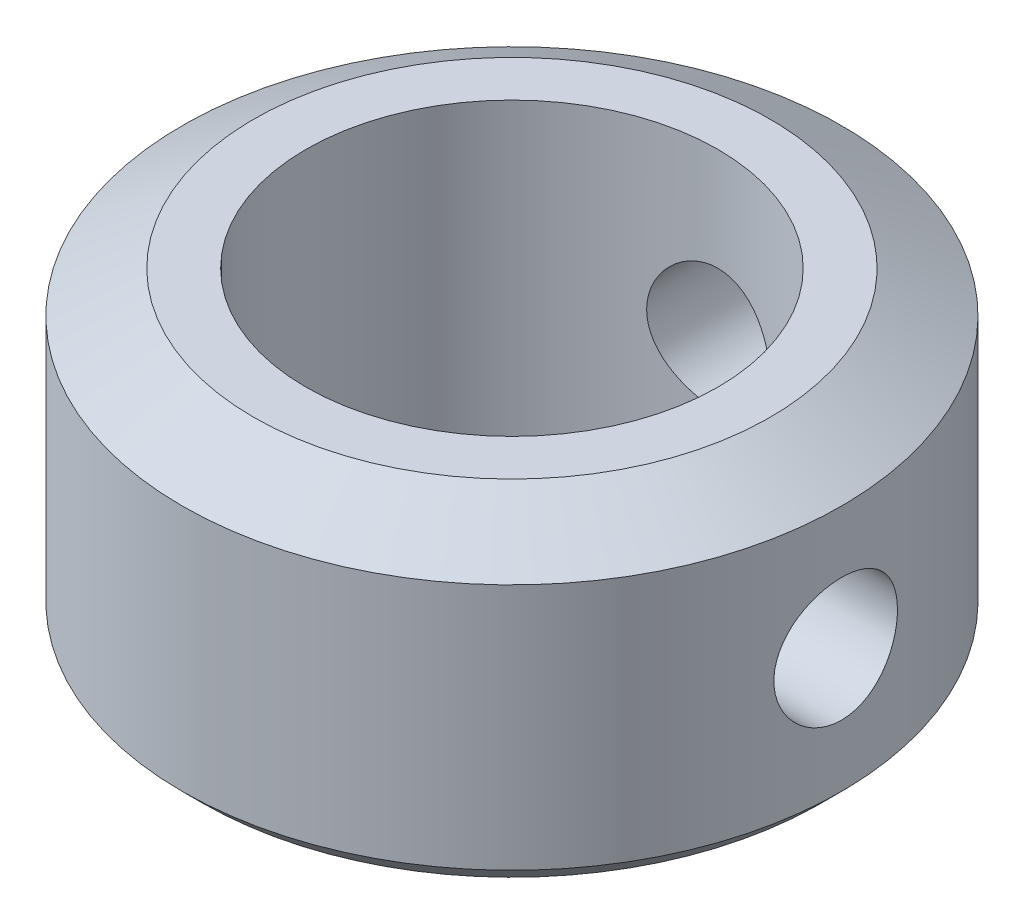
ISO-10303-21;
HEADER;
FILE_DESCRIPTION(('STEP AP214'),'2;1');
FILE_NAME('part.step','',(''),(''),'','','');
FILE_SCHEMA(('AUTOMOTIVE_DESIGN { 1 0 10303 214 1 1 1 1 }'));
ENDSEC;
DATA;
#1=APPLICATION_CONTEXT('core data for automotive mechanical design processes');
#2=APPLICATION_PROTOCOL_DEFINITION('international standard','automotive_design',2000,#1);
#3=PRODUCT_CONTEXT('',#1,'mechanical');
#4=PRODUCT('Part','Part','',(#3));
#5=PRODUCT_RELATED_PRODUCT_CATEGORY('part','',(#4));
#6=PRODUCT_DEFINITION_FORMATION('','',#4);
#7=PRODUCT_DEFINITION_CONTEXT('part definition',#1,'design');
#8=PRODUCT_DEFINITION('design','',#6,#7);
#9=PRODUCT_DEFINITION_SHAPE('','',#8);
#10=(LENGTH_UNIT() NAMED_UNIT(*) SI_UNIT(.MILLI.,.METRE.));
#11=(NAMED_UNIT(*) PLANE_ANGLE_UNIT() SI_UNIT($,.RADIAN.));
#12=(NAMED_UNIT(*) SI_UNIT($,.STERADIAN.) SOLID_ANGLE_UNIT());
#13=UNCERTAINTY_MEASURE_WITH_UNIT(LENGTH_MEASURE(1.E-05),#10,'distance_accuracy_value','');
#14=(GEOMETRIC_REPRESENTATION_CONTEXT(3) GLOBAL_UNCERTAINTY_ASSIGNED_CONTEXT((#13)) GLOBAL_UNIT_ASSIGNED_CONTEXT((#10,
#11,#12)) REPRESENTATION_CONTEXT('',''));
#15=CARTESIAN_POINT('',(0.,0.,0.));
#16=DIRECTION('',(0.,0.,1.));
#17=DIRECTION('',(1.,0.,0.));
#18=AXIS2_PLACEMENT_3D('',#15,#16,#17);
#19=CARTESIAN_POINT('',(0.,7.5,0.));
#20=DIRECTION('',(0.,1.,0.));
#21=DIRECTION('',(0.,0.,1.));
#22=AXIS2_PLACEMENT_3D('',#19,#20,#21);
#23=PLANE('',#22);
#24=CARTESIAN_POINT('',(0.,7.5,0.));
#25=DIRECTION('',(0.,1.,0.));
#26=DIRECTION('',(0.,0.,1.));
#27=AXIS2_PLACEMENT_3D('',#24,#25,#26);
#28=CIRCLE('',#27,6.26794919243112);
#29=CARTESIAN_POINT('',(0.,7.5,6.26794919243112));
#30=VERTEX_POINT('',#29);
#31=EDGE_CURVE('E55',#30,#30,#28,.T.);
#32=ORIENTED_EDGE('',*,*,#31,.T.);
#33=EDGE_LOOP('',(#32));
#34=FACE_BOUND('',#33,.T.);
#35=CARTESIAN_POINT('',(0.,7.5,0.));
#36=DIRECTION('',(0.,1.,0.));
#37=DIRECTION('',(0.,0.,1.));
#38=AXIS2_PLACEMENT_3D('',#35,#36,#37);
#39=CIRCLE('',#38,5.);
#40=CARTESIAN_POINT('',(0.,7.5,5.));
#41=VERTEX_POINT('',#40);
#42=EDGE_CURVE('E58',#41,#41,#39,.T.);
#43=ORIENTED_EDGE('',*,*,#42,.F.);
#44=EDGE_LOOP('',(#43));
#45=FACE_BOUND('',#44,.T.);
#46=ADVANCED_FACE('F32',(#34,#45),#23,.T.);
#47=CARTESIAN_POINT('',(0.,0.,0.));
#48=DIRECTION('',(0.,1.,0.));
#49=DIRECTION('',(0.,0.,1.));
#50=AXIS2_PLACEMENT_3D('',#47,#48,#49);
#51=PLANE('',#50);
#52=CARTESIAN_POINT('',(0.,0.,0.));
#53=DIRECTION('',(0.,1.,0.));
#54=DIRECTION('',(0.,0.,1.));
#55=AXIS2_PLACEMENT_3D('',#52,#53,#54);
#56=CIRCLE('',#55,5.2);
#57=CARTESIAN_POINT('',(0.,0.,5.2));
#58=VERTEX_POINT('',#57);
#59=EDGE_CURVE('E39',#58,#58,#56,.T.);
#60=ORIENTED_EDGE('',*,*,#59,.T.);
#61=EDGE_LOOP('',(#60));
#62=FACE_BOUND('',#61,.T.);
#63=CARTESIAN_POINT('',(0.,0.,0.));
#64=DIRECTION('',(0.,1.,0.));
#65=DIRECTION('',(0.,0.,1.));
#66=AXIS2_PLACEMENT_3D('',#63,#64,#65);
#67=CIRCLE('',#66,7.5);
#68=CARTESIAN_POINT('',(0.,0.,7.5));
#69=VERTEX_POINT('',#68);
#70=EDGE_CURVE('E43',#69,#69,#67,.F.);
#71=ORIENTED_EDGE('',*,*,#70,.T.);
#72=EDGE_LOOP('',(#71));
#73=FACE_BOUND('',#72,.T.);
#74=ADVANCED_FACE('F111',(#62,#73),#51,.F.);
#75=CARTESIAN_POINT('',(0.,7.5,0.));
#76=DIRECTION('',(0.,-1.,0.));
#77=DIRECTION('',(0.,0.,-1.));
#78=AXIS2_PLACEMENT_3D('',#75,#76,#77);
#79=CYLINDRICAL_SURFACE('',#78,8.);
#80=CARTESIAN_POINT('',(-1.50000000000003,3.5,-7.85811682275085));
#81=CARTESIAN_POINT('',(-1.49999679883248,3.58345720801174,-7.85811843793493));
#82=CARTESIAN_POINT('',(-1.49301126348939,3.66695594821839,-7.85946079760266));
#83=CARTESIAN_POINT('',(-1.46527253251808,3.83159896158191,-7.86467851014364));
#84=CARTESIAN_POINT('',(-1.4445076576848,3.91274117642748,-7.86855601173205));
#85=CARTESIAN_POINT('',(-1.3898703561779,4.07026507137087,-7.87838976464884));
#86=CARTESIAN_POINT('',(-1.35601013954377,4.14665110930729,-7.88434407905997));
#87=CARTESIAN_POINT('',(-1.27617565760369,4.29265355928681,-7.89765826320959));
#88=CARTESIAN_POINT('',(-1.23020233759196,4.3622704990033,-7.90501802325621));
#89=CARTESIAN_POINT('',(-1.12683678942625,4.49363019919913,-7.92041614838944));
#90=CARTESIAN_POINT('',(-1.06932292933094,4.55527648347173,-7.92846116625679));
#91=CARTESIAN_POINT('',(-0.944771778803578,4.66810438959956,-7.94426457664033));
#92=CARTESIAN_POINT('',(-0.877733863624972,4.71928532442479,-7.95202295031152));
#93=CARTESIAN_POINT('',(-0.735403894570189,4.81009937660052,-7.96645017828405));
#94=CARTESIAN_POINT('',(-0.660052840033892,4.84964153351942,-7.97311028052363));
#95=CARTESIAN_POINT('',(-0.503631283250789,4.91546954227353,-7.9845160863293));
#96=CARTESIAN_POINT('',(-0.422561251859532,4.94175648399022,-7.98926194728334));
#97=CARTESIAN_POINT('',(-0.258002746187443,4.98002954861113,-7.99625755123778));
#98=CARTESIAN_POINT('',(-0.174553323244884,4.99217830592268,-7.99853565976327));
#99=CARTESIAN_POINT('',(-0.00677167603540987,5.0023368877004,-8.00043684615594));
#100=CARTESIAN_POINT('',(0.0775604724476434,5.00034791613906,-8.00006015010697));
#101=CARTESIAN_POINT('',(0.24359835789937,4.98241222885285,-7.99671633763241));
#102=CARTESIAN_POINT('',(0.325323760451442,4.96664063056999,-7.99378172247214));
#103=CARTESIAN_POINT('',(0.484947165715449,4.92186435060476,-7.98568826333561));
#104=CARTESIAN_POINT('',(0.562845028826514,4.89285918665419,-7.98052933829966));
#105=CARTESIAN_POINT('',(0.713110065751494,4.8222722689417,-7.9685126029734));
#106=CARTESIAN_POINT('',(0.785443571838506,4.7806205120875,-7.96164537590826));
#107=CARTESIAN_POINT('',(0.922159977214611,4.68597433092284,-7.9469714754285));
#108=CARTESIAN_POINT('',(0.986542066910758,4.63297875311242,-7.93916470651164));
#109=CARTESIAN_POINT('',(1.10656561896901,4.51618429701647,-7.92333513680567));
#110=CARTESIAN_POINT('',(1.16205790757039,4.45223221609792,-7.91531085901622));
#111=CARTESIAN_POINT('',(1.26155171851258,4.31585046872137,-7.90006508924621));
#112=CARTESIAN_POINT('',(1.30555307271179,4.24342067823536,-7.89284360901351));
#113=CARTESIAN_POINT('',(1.38085852224475,4.09194172929734,-7.88001893307122));
#114=CARTESIAN_POINT('',(1.41214093645419,4.01288154280935,-7.87441850530262));
#115=CARTESIAN_POINT('',(1.46093656975053,3.8504988158768,-7.8655124239669));
#116=CARTESIAN_POINT('',(1.47845134901105,3.76717675953521,-7.8622065103862));
#117=CARTESIAN_POINT('',(1.49899672649736,3.59998067114412,-7.85831520301006));
#118=CARTESIAN_POINT('',(1.50224164285856,3.51613388443448,-7.85768955816137));
#119=CARTESIAN_POINT('',(1.49472968881722,3.34909654491285,-7.85912191420841));
#120=CARTESIAN_POINT('',(1.4839735108643,3.26590595985191,-7.86117978238612));
#121=CARTESIAN_POINT('',(1.4489486819588,3.10324709694561,-7.86770980063206));
#122=CARTESIAN_POINT('',(1.42479238583987,3.0237537473751,-7.87216186690879));
#123=CARTESIAN_POINT('',(1.36377224379057,2.86994281026984,-7.88296134156619));
#124=CARTESIAN_POINT('',(1.32690746128792,2.79562560468467,-7.88930888963282));
#125=CARTESIAN_POINT('',(1.24102353119657,2.65333238095683,-7.90327577863686));
#126=CARTESIAN_POINT('',(1.19186899639618,2.58543946213392,-7.91090895425316));
#127=CARTESIAN_POINT('',(1.08298344344244,2.45878795978567,-7.92654811368101));
#128=CARTESIAN_POINT('',(1.02325147433081,2.40003019844422,-7.93455413096494));
#129=CARTESIAN_POINT('',(0.893949417870357,2.29251623646587,-7.95016624005946));
#130=CARTESIAN_POINT('',(0.824258534095862,2.24390417339403,-7.95776555833305));
#131=CARTESIAN_POINT('',(0.677574523040111,2.15907879382233,-7.97159404810351));
#132=CARTESIAN_POINT('',(0.6005816770385,2.12286499997499,-7.97782327234725));
#133=CARTESIAN_POINT('',(0.441877541578655,2.06407990213592,-7.98818057995848));
#134=CARTESIAN_POINT('',(0.360193213078959,2.04143781243859,-7.99231954730142));
#135=CARTESIAN_POINT('',(0.194096227381542,2.01021295171011,-7.99807642083745));
#136=CARTESIAN_POINT('',(0.109683858215822,2.00162870133729,-7.99969459229933));
#137=CARTESIAN_POINT('',(-0.058090760250538,1.99881469848156,-8.00022227515441));
#138=CARTESIAN_POINT('',(-0.141449307066297,2.00436724687047,-7.99917286625032));
#139=CARTESIAN_POINT('',(-0.306023369279228,2.02919242776843,-7.99456866611703));
#140=CARTESIAN_POINT('',(-0.387238905213718,2.04846492874421,-7.99101389890671));
#141=CARTESIAN_POINT('',(-0.545106475595513,2.10009120738372,-7.98179837978045));
#142=CARTESIAN_POINT('',(-0.621766319318252,2.13242181288101,-7.97614135981576));
#143=CARTESIAN_POINT('',(-0.768605631316723,2.20922045365518,-7.96333372068771));
#144=CARTESIAN_POINT('',(-0.838784665003299,2.25368930210665,-7.95618300146483));
#145=CARTESIAN_POINT('',(-0.971755027780035,2.35425145444232,-7.94104779859941));
#146=CARTESIAN_POINT('',(-1.03442623539056,2.4105020338617,-7.93305284591271));
#147=CARTESIAN_POINT('',(-1.14951536065488,2.53270456249271,-7.91719633538833));
#148=CARTESIAN_POINT('',(-1.20193086324783,2.59865879037372,-7.90933480936764));
#149=CARTESIAN_POINT('',(-1.29547633945388,2.73912645470334,-7.89455577425925));
#150=CARTESIAN_POINT('',(-1.33649740531875,2.81371343966764,-7.88764767280728));
#151=CARTESIAN_POINT('',(-1.40536132423419,2.96882578997974,-7.87567084650032));
#152=CARTESIAN_POINT('',(-1.43321661638915,3.04934546658938,-7.87060038649116));
#153=CARTESIAN_POINT('',(-1.46929726596178,3.19175228806591,-7.86393016292124));
#154=CARTESIAN_POINT('',(-1.48079105739853,3.25280572376194,-7.86176310717932));
#155=CARTESIAN_POINT('',(-1.49614351076218,3.37589846842032,-7.85885585595504));
#156=CARTESIAN_POINT('',(-1.5000023805213,3.43793775050033,-7.85811562163282));
#157=CARTESIAN_POINT('',(-1.50000000000003,3.5,-7.85811682275085));
#158=B_SPLINE_CURVE_WITH_KNOTS('',3,(#80,#81,#82,#83,#84,#85,#86,#87,#88,#89,#90,#91,#92,#93,
#94,#95,#96,#97,#98,#99,#100,#101,#102,#103,#104,#105,#106,#107,#108,#109,#110,#111,#112,#113,
#114,#115,#116,#117,#118,#119,#120,#121,#122,#123,#124,#125,#126,#127,#128,#129,#130,#131,#132,
#133,#134,#135,#136,#137,#138,#139,#140,#141,#142,#143,#144,#145,#146,#147,#148,#149,#150,#151,
#152,#153,#154,#155,#156,#157),.UNSPECIFIED.,.T.,.F.,(4,2,2,2,2,2,2,2,2,2,2,2,2,2,2,2,2,2,2,2,2,
2,2,2,2,2,2,2,2,2,2,2,2,2,2,2,2,2,4),(0.,0.250144505793186,0.500501302380393,0.750625227978433,
1.00072963993908,1.25362335698691,1.50653367069315,1.76137104348047,2.0161874593964,
2.26804275460261,2.51987660200648,2.76855650598725,3.01724547328425,3.26733691984219,
3.51745380911785,3.77140614764064,4.025362201924,4.27974936118266,4.53410768866488,
4.78463248587075,5.03514489338718,5.28358792315369,5.53204926624317,5.78337862654143,
6.03473059394677,6.28944125495871,6.54414210821705,6.79750269418683,7.0508366166733,
7.30029300570138,7.54974700322167,7.79876026530358,8.0477902135711,8.30038464008745,
8.55303847730765,8.80803001818118,9.06278015749119,9.24880307527215,9.43482092920425),.UNSPECIFIED.);
#159=CARTESIAN_POINT('',(-1.50000000000003,3.5,-7.85811682275085));
#160=VERTEX_POINT('',#159);
#161=EDGE_CURVE('E90',#160,#160,#158,.T.);
#162=ORIENTED_EDGE('',*,*,#161,.F.);
#163=EDGE_LOOP('',(#162));
#164=FACE_BOUND('',#163,.T.);
#165=CARTESIAN_POINT('',(7.85811682275086,3.5,-1.5));
#166=CARTESIAN_POINT('',(7.85811843793494,3.58345720801174,-1.49999679883246));
#167=CARTESIAN_POINT('',(7.85946079760266,3.66695594821839,-1.49301126348936));
#168=CARTESIAN_POINT('',(7.86467851014364,3.83159896158191,-1.46527253251805));
#169=CARTESIAN_POINT('',(7.86855601173205,3.91274117642748,-1.44450765768477));
#170=CARTESIAN_POINT('',(7.87838976464885,4.07026507137087,-1.38987035617788));
#171=CARTESIAN_POINT('',(7.88434407905997,4.14665110930729,-1.35601013954374));
#172=CARTESIAN_POINT('',(7.89765826320959,4.29265355928681,-1.27617565760366));
#173=CARTESIAN_POINT('',(7.90501802325622,4.3622704990033,-1.23020233759193));
#174=CARTESIAN_POINT('',(7.92041614838944,4.49363019919913,-1.12683678942622));
#175=CARTESIAN_POINT('',(7.92846116625679,4.55527648347173,-1.06932292933092));
#176=CARTESIAN_POINT('',(7.94426457664034,4.66810438959956,-0.944771778803551));
#177=CARTESIAN_POINT('',(7.95202295031153,4.71928532442479,-0.877733863624944));
#178=CARTESIAN_POINT('',(7.96645017828405,4.81009937660052,-0.735403894570161));
#179=CARTESIAN_POINT('',(7.97311028052363,4.84964153351942,-0.660052840033864));
#180=CARTESIAN_POINT('',(7.98451608632931,4.91546954227353,-0.503631283250761));
#181=CARTESIAN_POINT('',(7.98926194728334,4.94175648399022,-0.422561251859505));
#182=CARTESIAN_POINT('',(7.99625755123778,4.98002954861113,-0.258002746187415));
#183=CARTESIAN_POINT('',(7.99853565976327,4.99217830592268,-0.174553323244856));
#184=CARTESIAN_POINT('',(8.00043684615594,5.0023368877004,-0.00677167603538234));
#185=CARTESIAN_POINT('',(8.00006015010697,5.00034791613906,0.077560472447671));
#186=CARTESIAN_POINT('',(7.99671633763241,4.98241222885285,0.243598357899397));
#187=CARTESIAN_POINT('',(7.99378172247214,4.96664063056999,0.32532376045147));
#188=CARTESIAN_POINT('',(7.98568826333561,4.92186435060476,0.484947165715476));
#189=CARTESIAN_POINT('',(7.98052933829966,4.89285918665419,0.562845028826541));
#190=CARTESIAN_POINT('',(7.96851260297339,4.8222722689417,0.713110065751522));
#191=CARTESIAN_POINT('',(7.96164537590825,4.7806205120875,0.785443571838533));
#192=CARTESIAN_POINT('',(7.9469714754285,4.68597433092285,0.922159977214638));
#193=CARTESIAN_POINT('',(7.93916470651164,4.63297875311242,0.986542066910785));
#194=CARTESIAN_POINT('',(7.92333513680567,4.51618429701647,1.10656561896904));
#195=CARTESIAN_POINT('',(7.91531085901621,4.45223221609792,1.16205790757041));
#196=CARTESIAN_POINT('',(7.9000650892462,4.31585046872137,1.26155171851261));
#197=CARTESIAN_POINT('',(7.89284360901351,4.24342067823536,1.30555307271182));
#198=CARTESIAN_POINT('',(7.88001893307121,4.09194172929734,1.38085852224478));
#199=CARTESIAN_POINT('',(7.87441850530261,4.01288154280935,1.41214093645421));
#200=CARTESIAN_POINT('',(7.86551242396689,3.8504988158768,1.46093656975056));
#201=CARTESIAN_POINT('',(7.8622065103862,3.76717675953521,1.47845134901108));
#202=CARTESIAN_POINT('',(7.85831520301005,3.59998067114412,1.49899672649739));
#203=CARTESIAN_POINT('',(7.85768955816136,3.51613388443448,1.50224164285859));
#204=CARTESIAN_POINT('',(7.8591219142084,3.34909654491285,1.49472968881724));
#205=CARTESIAN_POINT('',(7.86117978238611,3.26590595985191,1.48397351086433));
#206=CARTESIAN_POINT('',(7.86770980063205,3.10324709694561,1.44894868195883));
#207=CARTESIAN_POINT('',(7.87216186690878,3.0237537473751,1.4247923858399));
#208=CARTESIAN_POINT('',(7.88296134156619,2.86994281026984,1.3637722437906));
#209=CARTESIAN_POINT('',(7.88930888963281,2.79562560468467,1.32690746128795));
#210=CARTESIAN_POINT('',(7.90327577863685,2.65333238095683,1.2410235311966));
#211=CARTESIAN_POINT('',(7.91090895425315,2.58543946213393,1.19186899639621));
#212=CARTESIAN_POINT('',(7.926548113681,2.45878795978567,1.08298344344247));
#213=CARTESIAN_POINT('',(7.93455413096494,2.40003019844423,1.02325147433084));
#214=CARTESIAN_POINT('',(7.95016624005946,2.29251623646587,0.893949417870385));
#215=CARTESIAN_POINT('',(7.95776555833305,2.24390417339403,0.82425853409589));
#216=CARTESIAN_POINT('',(7.97159404810351,2.15907879382233,0.67757452304014));
#217=CARTESIAN_POINT('',(7.97782327234725,2.12286499997499,0.600581677038528));
#218=CARTESIAN_POINT('',(7.98818057995848,2.06407990213592,0.441877541578684));
#219=CARTESIAN_POINT('',(7.99231954730142,2.04143781243859,0.360193213078987));
#220=CARTESIAN_POINT('',(7.99807642083745,2.01021295171011,0.19409622738157));
#221=CARTESIAN_POINT('',(7.99969459229933,2.00162870133729,0.10968385821585));
#222=CARTESIAN_POINT('',(8.00022227515441,1.99881469848156,-0.0580907602505099));
#223=CARTESIAN_POINT('',(7.99917286625032,2.00436724687047,-0.141449307066269));
#224=CARTESIAN_POINT('',(7.99456866611703,2.02919242776843,-0.3060233692792));
#225=CARTESIAN_POINT('',(7.99101389890671,2.04846492874421,-0.38723890521369));
#226=CARTESIAN_POINT('',(7.98179837978045,2.10009120738372,-0.545106475595485));
#227=CARTESIAN_POINT('',(7.97614135981576,2.13242181288101,-0.621766319318224));
#228=CARTESIAN_POINT('',(7.96333372068771,2.20922045365518,-0.768605631316695));
#229=CARTESIAN_POINT('',(7.95618300146483,2.25368930210665,-0.838784665003271));
#230=CARTESIAN_POINT('',(7.94104779859941,2.35425145444232,-0.971755027780007));
#231=CARTESIAN_POINT('',(7.93305284591272,2.4105020338617,-1.03442623539053));
#232=CARTESIAN_POINT('',(7.91719633538833,2.53270456249271,-1.14951536065485));
#233=CARTESIAN_POINT('',(7.90933480936765,2.59865879037372,-1.2019308632478));
#234=CARTESIAN_POINT('',(7.89455577425926,2.73912645470334,-1.29547633945385));
#235=CARTESIAN_POINT('',(7.88764767280729,2.81371343966764,-1.33649740531872));
#236=CARTESIAN_POINT('',(7.87567084650033,2.96882578997974,-1.40536132423417));
#237=CARTESIAN_POINT('',(7.87060038649116,3.04934546658938,-1.43321661638912));
#238=CARTESIAN_POINT('',(7.86393016292125,3.19175228806591,-1.46929726596175));
#239=CARTESIAN_POINT('',(7.86176310717932,3.25280572376194,-1.4807910573985));
#240=CARTESIAN_POINT('',(7.85885585595504,3.37589846842032,-1.49614351076215));
#241=CARTESIAN_POINT('',(7.85811562163282,3.43793775050033,-1.50000238052127));
#242=CARTESIAN_POINT('',(7.85811682275086,3.5,-1.5));
#243=B_SPLINE_CURVE_WITH_KNOTS('',3,(#165,#166,#167,#168,#169,#170,#171,#172,#173,#174,#175,
#176,#177,#178,#179,#180,#181,#182,#183,#184,#185,#186,#187,#188,#189,#190,#191,#192,#193,#194,
#195,#196,#197,#198,#199,#200,#201,#202,#203,#204,#205,#206,#207,#208,#209,#210,#211,#212,#213,
#214,#215,#216,#217,#218,#219,#220,#221,#222,#223,#224,#225,#226,#227,#228,#229,#230,#231,#232,
#233,#234,#235,#236,#237,#238,#239,#240,#241,#242),.UNSPECIFIED.,.T.,.F.,(4,2,2,2,2,2,2,2,2,2,2,
2,2,2,2,2,2,2,2,2,2,2,2,2,2,2,2,2,2,2,2,2,2,2,2,2,2,2,4),(0.,0.250144505793187,
0.500501302380393,0.750625227978433,1.00072963993908,1.25362335698691,1.50653367069315,
1.76137104348047,2.0161874593964,2.26804275460261,2.51987660200648,2.76855650598725,
3.01724547328425,3.26733691984219,3.51745380911785,3.77140614764064,4.025362201924,
4.27974936118267,4.53410768866488,4.78463248587075,5.03514489338718,5.28358792315369,
5.53204926624317,5.78337862654143,6.03473059394677,6.28944125495871,6.54414210821705,
6.79750269418683,7.0508366166733,7.30029300570138,7.54974700322167,7.79876026530358,
8.0477902135711,8.30038464008745,8.55303847730765,8.80803001818118,9.06278015749119,
9.24880307527215,9.43482092920425),.UNSPECIFIED.);
#244=CARTESIAN_POINT('',(7.85811682275086,3.5,-1.5));
#245=VERTEX_POINT('',#244);
#246=EDGE_CURVE('E69',#245,#245,#243,.T.);
#247=ORIENTED_EDGE('',*,*,#246,.F.);
#248=EDGE_LOOP('',(#247));
#249=FACE_BOUND('',#248,.T.);
#250=CARTESIAN_POINT('',(0.,0.500000000000002,0.));
#251=DIRECTION('',(0.,1.,0.));
#252=DIRECTION('',(0.,0.,1.));
#253=AXIS2_PLACEMENT_3D('',#250,#251,#252);
#254=CIRCLE('',#253,8.);
#255=CARTESIAN_POINT('',(0.,0.500000000000002,8.));
#256=VERTEX_POINT('',#255);
#257=EDGE_CURVE('E47',#256,#256,#254,.T.);
#258=ORIENTED_EDGE('',*,*,#257,.T.);
#259=EDGE_LOOP('',(#258));
#260=FACE_BOUND('',#259,.T.);
#261=CARTESIAN_POINT('',(0.,6.5,0.));
#262=DIRECTION('',(0.,1.,0.));
#263=DIRECTION('',(0.,0.,1.));
#264=AXIS2_PLACEMENT_3D('',#261,#262,#263);
#265=CIRCLE('',#264,8.);
#266=CARTESIAN_POINT('',(0.,6.5,8.));
#267=VERTEX_POINT('',#266);
#268=EDGE_CURVE('E52',#267,#267,#265,.F.);
#269=ORIENTED_EDGE('',*,*,#268,.T.);
#270=EDGE_LOOP('',(#269));
#271=FACE_BOUND('',#270,.T.);
#272=ADVANCED_FACE('F107',(#164,#249,#260,#271),#79,.T.);
#273=CARTESIAN_POINT('',(0.,7.5,0.));
#274=DIRECTION('',(0.,-1.,0.));
#275=DIRECTION('',(0.,0.,-1.));
#276=AXIS2_PLACEMENT_3D('',#273,#274,#275);
#277=CYLINDRICAL_SURFACE('',#276,5.);
#278=CARTESIAN_POINT('',(-1.50000000000002,3.5,-4.76969600708472));
#279=CARTESIAN_POINT('',(-1.49999897633766,3.5821945479424,-4.76969685726979));
#280=CARTESIAN_POINT('',(-1.49322108167144,3.66439922414402,-4.77184390209068));
#281=CARTESIAN_POINT('',(-1.46635844446751,3.82640524959194,-4.78016578302899));
#282=CARTESIAN_POINT('',(-1.4462692557358,3.90620578650146,-4.78634196493467));
#283=CARTESIAN_POINT('',(-1.39352753269957,4.06103472827173,-4.80196102485632));
#284=CARTESIAN_POINT('',(-1.36089589394245,4.13607082963309,-4.81139846703232));
#285=CARTESIAN_POINT('',(-1.28406421917931,4.2796219339953,-4.83246932547566));
#286=CARTESIAN_POINT('',(-1.23986245137054,4.34813595868444,-4.84410307041019));
#287=CARTESIAN_POINT('',(-1.13964754141629,4.47886639057737,-4.86866862185765));
#288=CARTESIAN_POINT('',(-1.08333207175808,4.54084589794629,-4.88162808311635));
#289=CARTESIAN_POINT('',(-0.961136237579615,4.65463795132251,-4.90714861936757));
#290=CARTESIAN_POINT('',(-0.895254645461128,4.70644919044988,-4.91970964297705));
#291=CARTESIAN_POINT('',(-0.754111437793707,4.79946269983331,-4.94333214579389));
#292=CARTESIAN_POINT('',(-0.678684021335831,4.84042342444281,-4.95435724342404));
#293=CARTESIAN_POINT('',(-0.52162464536937,4.90898725904276,-4.97334435920684));
#294=CARTESIAN_POINT('',(-0.439994028387928,4.93659324985745,-4.98130703789495));
#295=CARTESIAN_POINT('',(-0.275323852630846,4.97688000109051,-4.99307646003589));
#296=CARTESIAN_POINT('',(-0.192391398953817,4.9899651276527,-4.99699557369338));
#297=CARTESIAN_POINT('',(-0.025421823749331,5.00211732464644,-5.00063201501348));
#298=CARTESIAN_POINT('',(0.0586150620503522,5.00118733940196,-5.00035022521079));
#299=CARTESIAN_POINT('',(0.222571156600144,4.98560713145697,-4.99569603817659));
#300=CARTESIAN_POINT('',(0.302536267641325,4.97139480619013,-4.9914542020526));
#301=CARTESIAN_POINT('',(0.45888921344251,4.93036866400571,-4.97951522112593));
#302=CARTESIAN_POINT('',(0.53527682132283,4.90355404905733,-4.97181785750586));
#303=CARTESIAN_POINT('',(0.683347326351264,4.83778797658144,-4.95365220986963));
#304=CARTESIAN_POINT('',(0.754965064694462,4.79869879719273,-4.94315269676706));
#305=CARTESIAN_POINT('',(0.89076467378314,4.70960214757177,-4.92049640648069));
#306=CARTESIAN_POINT('',(0.954944774872115,4.65959208703651,-4.90833923637778));
#307=CARTESIAN_POINT('',(1.07666048152978,4.5478022492484,-4.88311550488166));
#308=CARTESIAN_POINT('',(1.1338445804011,4.48564308097026,-4.87003195321461));
#309=CARTESIAN_POINT('',(1.23707651539822,4.35248998210995,-4.84483979887497));
#310=CARTESIAN_POINT('',(1.28312324482851,4.28149517461077,-4.8327312931702));
#311=CARTESIAN_POINT('',(1.36313995335449,4.13176053075101,-4.81077903197678));
#312=CARTESIAN_POINT('',(1.39698989237678,4.05295295413708,-4.80095810695957));
#313=CARTESIAN_POINT('',(1.45083362878412,3.89039279155445,-4.78496392548437));
#314=CARTESIAN_POINT('',(1.47083194640558,3.80664182846544,-4.7787894791583));
#315=CARTESIAN_POINT('',(1.49574770282163,3.63991763926072,-4.77104849541242));
#316=CARTESIAN_POINT('',(1.5011994638021,3.55703177610602,-4.76931878670441));
#317=CARTESIAN_POINT('',(1.49835947233061,3.39152709999013,-4.77021192441924));
#318=CARTESIAN_POINT('',(1.49006964371328,3.30890825126915,-4.7728341615659));
#319=CARTESIAN_POINT('',(1.46045763574188,3.14851162202913,-4.78197558554913));
#320=CARTESIAN_POINT('',(1.43947961431279,3.07066383573647,-4.78839176507489));
#321=CARTESIAN_POINT('',(1.38548577747938,2.91959830918508,-4.80429141231228));
#322=CARTESIAN_POINT('',(1.35246810342758,2.84638128585943,-4.81377535359074));
#323=CARTESIAN_POINT('',(1.27431871196499,2.70448253592787,-4.83505835023048));
#324=CARTESIAN_POINT('',(1.22888564172727,2.63597527901421,-4.84691271069799));
#325=CARTESIAN_POINT('',(1.12755301600383,2.50736189381919,-4.87148205646988));
#326=CARTESIAN_POINT('',(1.07165095534895,2.44725778238721,-4.88419724730004));
#327=CARTESIAN_POINT('',(0.948455132493581,2.33481959418526,-4.90963633548158));
#328=CARTESIAN_POINT('',(0.880811065857416,2.28286437101302,-4.92234245063004));
#329=CARTESIAN_POINT('',(0.737461784590231,2.19103329897225,-4.94584851748651));
#330=CARTESIAN_POINT('',(0.661756970543925,2.15115685021854,-4.95664856384717));
#331=CARTESIAN_POINT('',(0.504935504705203,2.0849999694317,-4.97505970474957));
#332=CARTESIAN_POINT('',(0.42386462203782,2.05861798384102,-4.98269453424966));
#333=CARTESIAN_POINT('',(0.258169966504569,2.01993908110958,-4.99401979596827));
#334=CARTESIAN_POINT('',(0.173547217354744,2.00763813405158,-4.9977113567088));
#335=CARTESIAN_POINT('',(0.00665215388272419,1.9977769559455,-5.00066544081399));
#336=CARTESIAN_POINT('',(-0.0755851790862252,1.99966730459217,-5.00009305111322));
#337=CARTESIAN_POINT('',(-0.238519481164422,2.01682163249912,-4.99497264465037));
#338=CARTESIAN_POINT('',(-0.319216537346547,2.03208485348044,-4.99042485330462));
#339=CARTESIAN_POINT('',(-0.475935813041377,2.07521166139962,-4.97791168358326));
#340=CARTESIAN_POINT('',(-0.55199892735141,2.10293818064901,-4.96998352900866));
#341=CARTESIAN_POINT('',(-0.698433237752071,2.17008191450719,-4.9515294303945));
#342=CARTESIAN_POINT('',(-0.768803496050598,2.20950105028619,-4.94100305949946));
#343=CARTESIAN_POINT('',(-0.904301892420582,2.30037345743004,-4.91803965828228));
#344=CARTESIAN_POINT('',(-0.969190250076786,2.35217143000077,-4.90555226923559));
#345=CARTESIAN_POINT('',(-1.08953757134596,2.4657103883328,-4.88023537212333));
#346=CARTESIAN_POINT('',(-1.14499380960195,2.52745423789815,-4.86740576641079));
#347=CARTESIAN_POINT('',(-1.2465626939455,2.66134077831051,-4.84240680631318));
#348=CARTESIAN_POINT('',(-1.29234759757958,2.73373855339044,-4.83026852693485));
#349=CARTESIAN_POINT('',(-1.37104313528777,2.88555517416102,-4.80852547508792));
#350=CARTESIAN_POINT('',(-1.4039599555729,2.9649706236012,-4.79891948596955));
#351=CARTESIAN_POINT('',(-1.45301942532951,3.11974043160627,-4.78427816717594));
#352=CARTESIAN_POINT('',(-1.47058859011233,3.19460864693099,-4.7788615484052));
#353=CARTESIAN_POINT('',(-1.49407818835146,3.34631522249577,-4.77157042597166));
#354=CARTESIAN_POINT('',(-1.50000095706097,3.42315318464525,-4.7696952122143));
#355=CARTESIAN_POINT('',(-1.50000000000002,3.5,-4.76969600708472));
#356=B_SPLINE_CURVE_WITH_KNOTS('',3,(#278,#279,#280,#281,#282,#283,#284,#285,#286,#287,#288,
#289,#290,#291,#292,#293,#294,#295,#296,#297,#298,#299,#300,#301,#302,#303,#304,#305,#306,#307,
#308,#309,#310,#311,#312,#313,#314,#315,#316,#317,#318,#319,#320,#321,#322,#323,#324,#325,#326,
#327,#328,#329,#330,#331,#332,#333,#334,#335,#336,#337,#338,#339,#340,#341,#342,#343,#344,#345,
#346,#347,#348,#349,#350,#351,#352,#353,#354,#355),.UNSPECIFIED.,.T.,.F.,(4,2,2,2,2,2,2,2,2,2,2,
2,2,2,2,2,2,2,2,2,2,2,2,2,2,2,2,2,2,2,2,2,2,2,2,2,2,2,4),(0.,0.246300165915543,
0.492682641689001,0.738656414466194,0.984667025370102,1.23773150007984,1.49082847871273,
1.74915939273645,2.00743455587877,2.25832140149558,2.50915554101441,2.7520012599088,
2.99486235890376,3.24055209335676,3.48630016590831,3.74152147023278,3.99676812491863,
4.25446238246266,4.51207250628411,4.76008080790309,5.00805439107388,5.24958594938817,
5.49115481045787,5.73920731809388,5.98731925928923,6.24479506100602,6.50225807324202,
6.75775391814325,7.01317662321682,7.2587630391122,7.50433553047754,7.74727096872219,
7.99024634491378,8.24099627054488,8.4918185262989,8.75011639669147,9.00828993963944,
9.23861153857447,9.4688869503356),.UNSPECIFIED.);
#357=CARTESIAN_POINT('',(-1.50000000000002,3.5,-4.76969600708472));
#358=VERTEX_POINT('',#357);
#359=EDGE_CURVE('E94',#358,#358,#356,.T.);
#360=ORIENTED_EDGE('',*,*,#359,.T.);
#361=EDGE_LOOP('',(#360));
#362=FACE_BOUND('',#361,.T.);
#363=CARTESIAN_POINT('',(4.76969600708473,3.5,-1.5));
#364=CARTESIAN_POINT('',(4.7696968572698,3.5821945479424,-1.49999897633764));
#365=CARTESIAN_POINT('',(4.77184390209069,3.66439922414402,-1.49322108167142));
#366=CARTESIAN_POINT('',(4.780165783029,3.82640524959194,-1.46635844446749));
#367=CARTESIAN_POINT('',(4.78634196493468,3.90620578650146,-1.44626925573578));
#368=CARTESIAN_POINT('',(4.80196102485633,4.06103472827173,-1.39352753269955));
#369=CARTESIAN_POINT('',(4.81139846703232,4.13607082963309,-1.36089589394243));
#370=CARTESIAN_POINT('',(4.83246932547567,4.2796219339953,-1.28406421917929));
#371=CARTESIAN_POINT('',(4.84410307041019,4.34813595868444,-1.23986245137053));
#372=CARTESIAN_POINT('',(4.86866862185765,4.47886639057737,-1.13964754141627));
#373=CARTESIAN_POINT('',(4.88162808311636,4.54084589794629,-1.08333207175807));
#374=CARTESIAN_POINT('',(4.90714861936757,4.65463795132251,-0.961136237579599));
#375=CARTESIAN_POINT('',(4.91970964297705,4.70644919044988,-0.895254645461111));
#376=CARTESIAN_POINT('',(4.94333214579389,4.79946269983331,-0.75411143779369));
#377=CARTESIAN_POINT('',(4.95435724342404,4.84042342444281,-0.678684021335814));
#378=CARTESIAN_POINT('',(4.97334435920684,4.90898725904276,-0.521624645369353));
#379=CARTESIAN_POINT('',(4.98130703789495,4.93659324985745,-0.439994028387911));
#380=CARTESIAN_POINT('',(4.99307646003589,4.97688000109051,-0.275323852630829));
#381=CARTESIAN_POINT('',(4.99699557369338,4.9899651276527,-0.1923913989538));
#382=CARTESIAN_POINT('',(5.00063201501348,5.00211732464644,-0.0254218237493144));
#383=CARTESIAN_POINT('',(5.00035022521079,5.00118733940196,0.0586150620503689));
#384=CARTESIAN_POINT('',(4.99569603817659,4.98560713145697,0.222571156600161));
#385=CARTESIAN_POINT('',(4.9914542020526,4.97139480619013,0.302536267641342));
#386=CARTESIAN_POINT('',(4.97951522112593,4.93036866400571,0.458889213442527));
#387=CARTESIAN_POINT('',(4.97181785750586,4.90355404905733,0.535276821322846));
#388=CARTESIAN_POINT('',(4.95365220986963,4.83778797658144,0.683347326351281));
#389=CARTESIAN_POINT('',(4.94315269676706,4.79869879719273,0.754965064694478));
#390=CARTESIAN_POINT('',(4.92049640648069,4.70960214757177,0.890764673783156));
#391=CARTESIAN_POINT('',(4.90833923637778,4.65959208703651,0.954944774872131));
#392=CARTESIAN_POINT('',(4.88311550488165,4.5478022492484,1.0766604815298));
#393=CARTESIAN_POINT('',(4.87003195321461,4.48564308097026,1.13384458040111));
#394=CARTESIAN_POINT('',(4.84483979887497,4.35248998210995,1.23707651539824));
#395=CARTESIAN_POINT('',(4.8327312931702,4.28149517461077,1.28312324482853));
#396=CARTESIAN_POINT('',(4.81077903197678,4.13176053075101,1.3631399533545));
#397=CARTESIAN_POINT('',(4.80095810695957,4.05295295413708,1.39698989237679));
#398=CARTESIAN_POINT('',(4.78496392548436,3.89039279155445,1.45083362878413));
#399=CARTESIAN_POINT('',(4.7787894791583,3.80664182846544,1.4708319464056));
#400=CARTESIAN_POINT('',(4.77104849541241,3.63991763926072,1.49574770282165));
#401=CARTESIAN_POINT('',(4.7693187867044,3.55703177610602,1.50119946380212));
#402=CARTESIAN_POINT('',(4.77021192441924,3.39152709999013,1.49835947233062));
#403=CARTESIAN_POINT('',(4.77283416156589,3.30890825126915,1.4900696437133));
#404=CARTESIAN_POINT('',(4.78197558554912,3.14851162202913,1.4604576357419));
#405=CARTESIAN_POINT('',(4.78839176507489,3.07066383573648,1.4394796143128));
#406=CARTESIAN_POINT('',(4.80429141231227,2.91959830918508,1.3854857774794));
#407=CARTESIAN_POINT('',(4.81377535359073,2.84638128585943,1.3524681034276));
#408=CARTESIAN_POINT('',(4.83505835023047,2.70448253592787,1.274318711965));
#409=CARTESIAN_POINT('',(4.84691271069799,2.63597527901421,1.22888564172729));
#410=CARTESIAN_POINT('',(4.87148205646987,2.5073618938192,1.12755301600385));
#411=CARTESIAN_POINT('',(4.88419724730003,2.44725778238721,1.07165095534897));
#412=CARTESIAN_POINT('',(4.90963633548158,2.33481959418526,0.948455132493598));
#413=CARTESIAN_POINT('',(4.92234245063004,2.28286437101302,0.880811065857434));
#414=CARTESIAN_POINT('',(4.94584851748651,2.19103329897225,0.737461784590248));
#415=CARTESIAN_POINT('',(4.95664856384717,2.15115685021854,0.661756970543943));
#416=CARTESIAN_POINT('',(4.97505970474957,2.0849999694317,0.504935504705221));
#417=CARTESIAN_POINT('',(4.98269453424966,2.05861798384102,0.423864622037839));
#418=CARTESIAN_POINT('',(4.99401979596827,2.01993908110958,0.258169966504588));
#419=CARTESIAN_POINT('',(4.9977113567088,2.00763813405158,0.173547217354762));
#420=CARTESIAN_POINT('',(5.00066544081399,1.9977769559455,0.00665215388274223));
#421=CARTESIAN_POINT('',(5.00009305111322,1.99966730459217,-0.0755851790862073));
#422=CARTESIAN_POINT('',(4.99497264465037,2.01682163249912,-0.238519481164404));
#423=CARTESIAN_POINT('',(4.99042485330463,2.03208485348044,-0.319216537346529));
#424=CARTESIAN_POINT('',(4.97791168358327,2.07521166139962,-0.475935813041359));
#425=CARTESIAN_POINT('',(4.96998352900866,2.10293818064901,-0.551998927351392));
#426=CARTESIAN_POINT('',(4.9515294303945,2.17008191450719,-0.698433237752053));
#427=CARTESIAN_POINT('',(4.94100305949946,2.20950105028619,-0.76880349605058));
#428=CARTESIAN_POINT('',(4.91803965828228,2.30037345743003,-0.904301892420563));
#429=CARTESIAN_POINT('',(4.90555226923559,2.35217143000077,-0.969190250076767));
#430=CARTESIAN_POINT('',(4.88023537212334,2.4657103883328,-1.08953757134594));
#431=CARTESIAN_POINT('',(4.86740576641079,2.52745423789815,-1.14499380960194));
#432=CARTESIAN_POINT('',(4.84240680631319,2.66134077831051,-1.24656269394549));
#433=CARTESIAN_POINT('',(4.83026852693485,2.73373855339044,-1.29234759757956));
#434=CARTESIAN_POINT('',(4.80852547508793,2.88555517416102,-1.37104313528776));
#435=CARTESIAN_POINT('',(4.79891948596955,2.96497062360119,-1.40395995557289));
#436=CARTESIAN_POINT('',(4.78427816717595,3.11974043160627,-1.4530194253295));
#437=CARTESIAN_POINT('',(4.7788615484052,3.19460864693099,-1.47058859011232));
#438=CARTESIAN_POINT('',(4.77157042597167,3.34631522249577,-1.49407818835144));
#439=CARTESIAN_POINT('',(4.7696952122143,3.42315318464525,-1.50000095706095));
#440=CARTESIAN_POINT('',(4.76969600708473,3.5,-1.5));
#441=B_SPLINE_CURVE_WITH_KNOTS('',3,(#363,#364,#365,#366,#367,#368,#369,#370,#371,#372,#373,
#374,#375,#376,#377,#378,#379,#380,#381,#382,#383,#384,#385,#386,#387,#388,#389,#390,#391,#392,
#393,#394,#395,#396,#397,#398,#399,#400,#401,#402,#403,#404,#405,#406,#407,#408,#409,#410,#411,
#412,#413,#414,#415,#416,#417,#418,#419,#420,#421,#422,#423,#424,#425,#426,#427,#428,#429,#430,
#431,#432,#433,#434,#435,#436,#437,#438,#439,#440),.UNSPECIFIED.,.T.,.F.,(4,2,2,2,2,2,2,2,2,2,2,
2,2,2,2,2,2,2,2,2,2,2,2,2,2,2,2,2,2,2,2,2,2,2,2,2,2,2,4),(0.,0.246300165915542,0.492682641689,
0.738656414466193,0.984667025370101,1.23773150007984,1.49082847871273,1.74915939273645,
2.00743455587877,2.25832140149558,2.5091555410144,2.7520012599088,2.99486235890376,
3.24055209335676,3.48630016590831,3.74152147023278,3.99676812491863,4.25446238246266,
4.51207250628411,4.76008080790309,5.00805439107388,5.24958594938817,5.49115481045787,
5.73920731809388,5.98731925928923,6.24479506100602,6.50225807324202,6.75775391814325,
7.01317662321682,7.2587630391122,7.50433553047754,7.74727096872219,7.99024634491378,
8.24099627054488,8.4918185262989,8.75011639669147,9.00828993963944,9.23861153857447,
9.4688869503356),.UNSPECIFIED.);
#442=CARTESIAN_POINT('',(4.76969600708473,3.5,-1.5));
#443=VERTEX_POINT('',#442);
#444=EDGE_CURVE('E61',#443,#443,#441,.T.);
#445=ORIENTED_EDGE('',*,*,#444,.T.);
#446=EDGE_LOOP('',(#445));
#447=FACE_BOUND('',#446,.T.);
#448=CARTESIAN_POINT('',(0.,0.200000000000001,0.));
#449=DIRECTION('',(0.,1.,0.));
#450=DIRECTION('',(0.,0.,1.));
#451=AXIS2_PLACEMENT_3D('',#448,#449,#450);
#452=CIRCLE('',#451,5.);
#453=CARTESIAN_POINT('',(0.,0.200000000000001,5.));
#454=VERTEX_POINT('',#453);
#455=EDGE_CURVE('E10',#454,#454,#452,.F.);
#456=ORIENTED_EDGE('',*,*,#455,.T.);
#457=EDGE_LOOP('',(#456));
#458=FACE_BOUND('',#457,.T.);
#459=ORIENTED_EDGE('',*,*,#42,.T.);
#460=EDGE_LOOP('',(#459));
#461=FACE_BOUND('',#460,.T.);
#462=ADVANCED_FACE('F110',(#362,#447,#458,#461),#277,.F.);
#463=CARTESIAN_POINT('',(0.,7.5,0.));
#464=DIRECTION('',(0.,-1.,0.));
#465=DIRECTION('',(0.,0.,-1.));
#466=AXIS2_PLACEMENT_3D('',#463,#464,#465);
#467=CONICAL_SURFACE('',#466,6.26794919243112,1.0471975511966);
#468=ORIENTED_EDGE('',*,*,#268,.F.);
#469=EDGE_LOOP('',(#468));
#470=FACE_BOUND('',#469,.T.);
#471=ORIENTED_EDGE('',*,*,#31,.F.);
#472=EDGE_LOOP('',(#471));
#473=FACE_BOUND('',#472,.T.);
#474=ADVANCED_FACE('F119',(#470,#473),#467,.T.);
#475=CARTESIAN_POINT('',(0.,0.500000000000002,0.));
#476=DIRECTION('',(0.,1.,0.));
#477=DIRECTION('',(0.,0.,1.));
#478=AXIS2_PLACEMENT_3D('',#475,#476,#477);
#479=CONICAL_SURFACE('',#478,8.,0.78539816339745);
#480=ORIENTED_EDGE('',*,*,#70,.F.);
#481=EDGE_LOOP('',(#480));
#482=FACE_BOUND('',#481,.T.);
#483=ORIENTED_EDGE('',*,*,#257,.F.);
#484=EDGE_LOOP('',(#483));
#485=FACE_BOUND('',#484,.T.);
#486=ADVANCED_FACE('F122',(#482,#485),#479,.T.);
#487=CARTESIAN_POINT('',(0.,0.,0.));
#488=DIRECTION('',(0.,-1.,0.));
#489=DIRECTION('',(0.,0.,-1.));
#490=AXIS2_PLACEMENT_3D('',#487,#488,#489);
#491=CONICAL_SURFACE('',#490,5.2,0.785398163397438);
#492=ORIENTED_EDGE('',*,*,#455,.F.);
#493=EDGE_LOOP('',(#492));
#494=FACE_BOUND('',#493,.T.);
#495=ORIENTED_EDGE('',*,*,#59,.F.);
#496=EDGE_LOOP('',(#495));
#497=FACE_BOUND('',#496,.T.);
#498=ADVANCED_FACE('F34',(#494,#497),#491,.F.);
#499=CARTESIAN_POINT('',(-8.001,3.5,0.));
#500=DIRECTION('',(1.,0.,0.));
#501=DIRECTION('',(0.,0.,-1.));
#502=AXIS2_PLACEMENT_3D('',#499,#500,#501);
#503=CYLINDRICAL_SURFACE('',#502,1.5);
#504=ORIENTED_EDGE('',*,*,#444,.F.);
#505=EDGE_LOOP('',(#504));
#506=FACE_BOUND('',#505,.T.);
#507=ORIENTED_EDGE('',*,*,#246,.T.);
#508=EDGE_LOOP('',(#507));
#509=FACE_BOUND('',#508,.T.);
#510=ADVANCED_FACE('F75',(#506,#509),#503,.F.);
#511=CARTESIAN_POINT('',(0.,3.5,8.00100000000003));
#512=DIRECTION('',(0.,0.,-1.));
#513=DIRECTION('',(-1.,0.,0.));
#514=AXIS2_PLACEMENT_3D('',#511,#512,#513);
#515=CYLINDRICAL_SURFACE('',#514,1.5);
#516=ORIENTED_EDGE('',*,*,#359,.F.);
#517=EDGE_LOOP('',(#516));
#518=FACE_BOUND('',#517,.T.);
#519=ORIENTED_EDGE('',*,*,#161,.T.);
#520=EDGE_LOOP('',(#519));
#521=FACE_BOUND('',#520,.T.);
#522=ADVANCED_FACE('F80',(#518,#521),#515,.F.);
#523=CLOSED_SHELL('',(#46,#74,#272,#462,#474,#486,#498,#510,#522));
#524=MANIFOLD_SOLID_BREP('B2',#523);
#525=ADVANCED_BREP_SHAPE_REPRESENTATION('',(#18,#524),#14);
#526=SHAPE_DEFINITION_REPRESENTATION(#9,#525);
ENDSEC;
END-ISO-10303-21;
